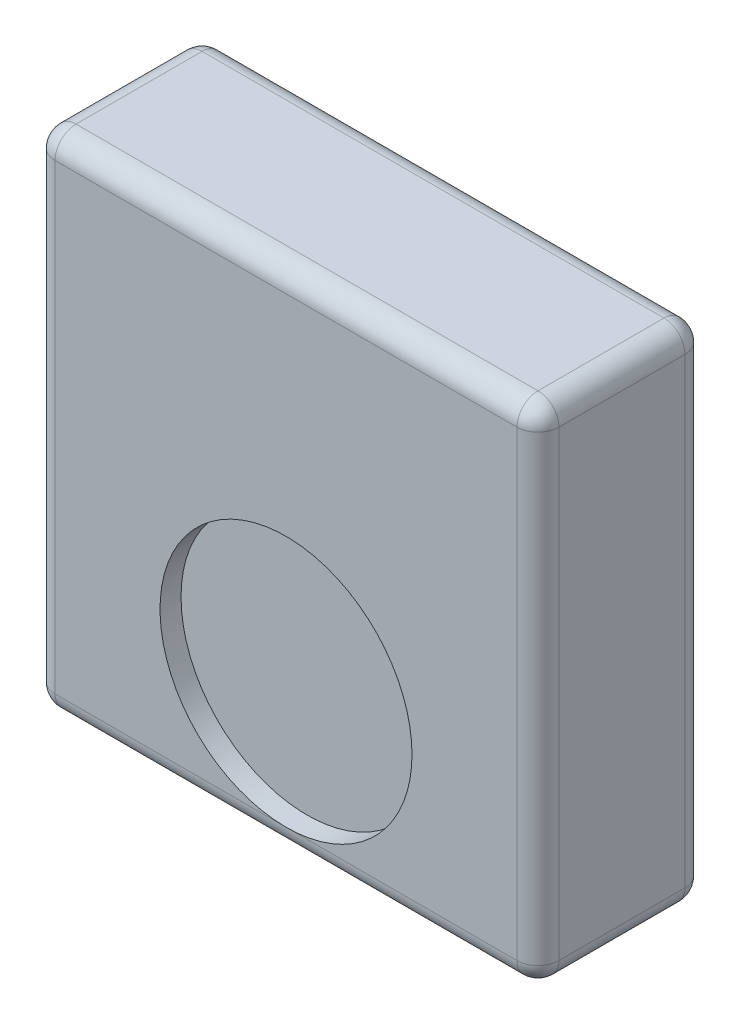
ISO-10303-21;
HEADER;
FILE_DESCRIPTION(('STEP AP214'),'2;1');
FILE_NAME('part.step','',(''),(''),'','','');
FILE_SCHEMA(('AUTOMOTIVE_DESIGN { 1 0 10303 214 1 1 1 1 }'));
ENDSEC;
DATA;
#1=APPLICATION_CONTEXT('core data for automotive mechanical design processes');
#2=APPLICATION_PROTOCOL_DEFINITION('international standard','automotive_design',2000,#1);
#3=PRODUCT_CONTEXT('',#1,'mechanical');
#4=PRODUCT('Part','Part','',(#3));
#5=PRODUCT_RELATED_PRODUCT_CATEGORY('part','',(#4));
#6=PRODUCT_DEFINITION_FORMATION('','',#4);
#7=PRODUCT_DEFINITION_CONTEXT('part definition',#1,'design');
#8=PRODUCT_DEFINITION('design','',#6,#7);
#9=PRODUCT_DEFINITION_SHAPE('','',#8);
#10=(LENGTH_UNIT() NAMED_UNIT(*) SI_UNIT(.MILLI.,.METRE.));
#11=(NAMED_UNIT(*) PLANE_ANGLE_UNIT() SI_UNIT($,.RADIAN.));
#12=(NAMED_UNIT(*) SI_UNIT($,.STERADIAN.) SOLID_ANGLE_UNIT());
#13=UNCERTAINTY_MEASURE_WITH_UNIT(LENGTH_MEASURE(1.E-05),#10,'distance_accuracy_value','');
#14=(GEOMETRIC_REPRESENTATION_CONTEXT(3) GLOBAL_UNCERTAINTY_ASSIGNED_CONTEXT((#13)) GLOBAL_UNIT_ASSIGNED_CONTEXT((#10,
#11,#12)) REPRESENTATION_CONTEXT('',''));
#15=CARTESIAN_POINT('',(0.,0.,0.));
#16=DIRECTION('',(0.,0.,1.));
#17=DIRECTION('',(1.,0.,0.));
#18=AXIS2_PLACEMENT_3D('',#15,#16,#17);
#19=CARTESIAN_POINT('',(76.2,-76.2,25.4));
#20=DIRECTION('',(-1.,0.,0.));
#21=DIRECTION('',(0.,-1.,0.));
#22=AXIS2_PLACEMENT_3D('',#19,#20,#21);
#23=PLANE('',#22);
#24=DIRECTION('',(0.,0.,-1.));
#25=VECTOR('',#24,1.);
#26=CARTESIAN_POINT('',(76.2,69.85,25.4));
#27=LINE('',#26,#25);
#28=CARTESIAN_POINT('',(76.2,69.85,-19.05));
#29=VERTEX_POINT('',#28);
#30=CARTESIAN_POINT('',(76.2,69.85,19.05));
#31=VERTEX_POINT('',#30);
#32=EDGE_CURVE('E157',#29,#31,#27,.F.);
#33=ORIENTED_EDGE('',*,*,#32,.T.);
#34=DIRECTION('',(0.,1.,0.));
#35=VECTOR('',#34,1.);
#36=CARTESIAN_POINT('',(76.2,-76.2,19.05));
#37=LINE('',#36,#35);
#38=CARTESIAN_POINT('',(76.2,-69.85,19.05));
#39=VERTEX_POINT('',#38);
#40=EDGE_CURVE('E159',#31,#39,#37,.F.);
#41=ORIENTED_EDGE('',*,*,#40,.T.);
#42=DIRECTION('',(0.,0.,-1.));
#43=VECTOR('',#42,1.);
#44=CARTESIAN_POINT('',(76.2,-69.85,25.4));
#45=LINE('',#44,#43);
#46=CARTESIAN_POINT('',(76.2,-69.85,-19.05));
#47=VERTEX_POINT('',#46);
#48=EDGE_CURVE('E153',#39,#47,#45,.T.);
#49=ORIENTED_EDGE('',*,*,#48,.T.);
#50=DIRECTION('',(0.,1.,0.));
#51=VECTOR('',#50,1.);
#52=CARTESIAN_POINT('',(76.2,76.2,-19.05));
#53=LINE('',#52,#51);
#54=EDGE_CURVE('E155',#47,#29,#53,.T.);
#55=ORIENTED_EDGE('',*,*,#54,.T.);
#56=EDGE_LOOP('',(#33,#41,#49,#55));
#57=FACE_BOUND('',#56,.T.);
#58=ADVANCED_FACE('F35',(#57),#23,.F.);
#59=CARTESIAN_POINT('',(-76.2,76.2,25.4));
#60=DIRECTION('',(0.,-1.,0.));
#61=DIRECTION('',(0.,0.,-1.));
#62=AXIS2_PLACEMENT_3D('',#59,#60,#61);
#63=PLANE('',#62);
#64=DIRECTION('',(-1.,0.,0.));
#65=VECTOR('',#64,1.);
#66=CARTESIAN_POINT('',(-76.2,76.2,19.05));
#67=LINE('',#66,#65);
#68=CARTESIAN_POINT('',(-69.85,76.2,19.05));
#69=VERTEX_POINT('',#68);
#70=CARTESIAN_POINT('',(69.85,76.2,19.05));
#71=VERTEX_POINT('',#70);
#72=EDGE_CURVE('E166',#69,#71,#67,.F.);
#73=ORIENTED_EDGE('',*,*,#72,.T.);
#74=DIRECTION('',(0.,0.,-1.));
#75=VECTOR('',#74,1.);
#76=CARTESIAN_POINT('',(69.85,76.2,25.4));
#77=LINE('',#76,#75);
#78=CARTESIAN_POINT('',(69.85,76.2,-19.05));
#79=VERTEX_POINT('',#78);
#80=EDGE_CURVE('E168',#71,#79,#77,.T.);
#81=ORIENTED_EDGE('',*,*,#80,.T.);
#82=DIRECTION('',(-1.,0.,0.));
#83=VECTOR('',#82,1.);
#84=CARTESIAN_POINT('',(-76.2,76.2,-19.05));
#85=LINE('',#84,#83);
#86=CARTESIAN_POINT('',(-69.85,76.2,-19.05));
#87=VERTEX_POINT('',#86);
#88=EDGE_CURVE('E164',#79,#87,#85,.T.);
#89=ORIENTED_EDGE('',*,*,#88,.T.);
#90=DIRECTION('',(0.,0.,-1.));
#91=VECTOR('',#90,1.);
#92=CARTESIAN_POINT('',(-69.85,76.2,25.4));
#93=LINE('',#92,#91);
#94=EDGE_CURVE('E162',#87,#69,#93,.F.);
#95=ORIENTED_EDGE('',*,*,#94,.T.);
#96=EDGE_LOOP('',(#73,#81,#89,#95));
#97=FACE_BOUND('',#96,.T.);
#98=ADVANCED_FACE('F283',(#97),#63,.F.);
#99=CARTESIAN_POINT('',(-76.2,-76.2,25.4));
#100=DIRECTION('',(1.,0.,0.));
#101=DIRECTION('',(0.,0.,-1.));
#102=AXIS2_PLACEMENT_3D('',#99,#100,#101);
#103=PLANE('',#102);
#104=DIRECTION('',(0.,-1.,0.));
#105=VECTOR('',#104,1.);
#106=CARTESIAN_POINT('',(-76.2,-76.2,19.05));
#107=LINE('',#106,#105);
#108=CARTESIAN_POINT('',(-76.2,-69.85,19.05));
#109=VERTEX_POINT('',#108);
#110=CARTESIAN_POINT('',(-76.2,69.85,19.05));
#111=VERTEX_POINT('',#110);
#112=EDGE_CURVE('E44',#109,#111,#107,.F.);
#113=ORIENTED_EDGE('',*,*,#112,.T.);
#114=DIRECTION('',(0.,0.,-1.));
#115=VECTOR('',#114,1.);
#116=CARTESIAN_POINT('',(-76.2,69.85,25.4));
#117=LINE('',#116,#115);
#118=CARTESIAN_POINT('',(-76.2,69.85,-19.05));
#119=VERTEX_POINT('',#118);
#120=EDGE_CURVE('E11',#111,#119,#117,.T.);
#121=ORIENTED_EDGE('',*,*,#120,.T.);
#122=DIRECTION('',(0.,-1.,0.));
#123=VECTOR('',#122,1.);
#124=CARTESIAN_POINT('',(-76.2,-76.2,-19.05));
#125=LINE('',#124,#123);
#126=CARTESIAN_POINT('',(-76.2,-69.85,-19.05));
#127=VERTEX_POINT('',#126);
#128=EDGE_CURVE('E189',#119,#127,#125,.T.);
#129=ORIENTED_EDGE('',*,*,#128,.T.);
#130=DIRECTION('',(0.,0.,-1.));
#131=VECTOR('',#130,1.);
#132=CARTESIAN_POINT('',(-76.2,-69.85,25.4));
#133=LINE('',#132,#131);
#134=EDGE_CURVE('E55',#127,#109,#133,.F.);
#135=ORIENTED_EDGE('',*,*,#134,.T.);
#136=EDGE_LOOP('',(#113,#121,#129,#135));
#137=FACE_BOUND('',#136,.T.);
#138=ADVANCED_FACE('F265',(#137),#103,.F.);
#139=CARTESIAN_POINT('',(-76.2,-76.2,25.4));
#140=DIRECTION('',(0.,1.,0.));
#141=DIRECTION('',(-1.,0.,0.));
#142=AXIS2_PLACEMENT_3D('',#139,#140,#141);
#143=PLANE('',#142);
#144=DIRECTION('',(0.,0.,-1.));
#145=VECTOR('',#144,1.);
#146=CARTESIAN_POINT('',(69.85,-76.2,25.4));
#147=LINE('',#146,#145);
#148=CARTESIAN_POINT('',(69.85,-76.2,-19.05));
#149=VERTEX_POINT('',#148);
#150=CARTESIAN_POINT('',(69.85,-76.2,19.05));
#151=VERTEX_POINT('',#150);
#152=EDGE_CURVE('E184',#149,#151,#147,.F.);
#153=ORIENTED_EDGE('',*,*,#152,.T.);
#154=DIRECTION('',(1.,0.,0.));
#155=VECTOR('',#154,1.);
#156=CARTESIAN_POINT('',(-76.2,-76.2,19.05));
#157=LINE('',#156,#155);
#158=CARTESIAN_POINT('',(-69.85,-76.2,19.05));
#159=VERTEX_POINT('',#158);
#160=EDGE_CURVE('E186',#151,#159,#157,.F.);
#161=ORIENTED_EDGE('',*,*,#160,.T.);
#162=DIRECTION('',(0.,0.,-1.));
#163=VECTOR('',#162,1.);
#164=CARTESIAN_POINT('',(-69.85,-76.2,25.4));
#165=LINE('',#164,#163);
#166=CARTESIAN_POINT('',(-69.85,-76.2,-19.05));
#167=VERTEX_POINT('',#166);
#168=EDGE_CURVE('E180',#159,#167,#165,.T.);
#169=ORIENTED_EDGE('',*,*,#168,.T.);
#170=DIRECTION('',(1.,0.,0.));
#171=VECTOR('',#170,1.);
#172=CARTESIAN_POINT('',(76.2,-76.2,-19.05));
#173=LINE('',#172,#171);
#174=EDGE_CURVE('E182',#167,#149,#173,.T.);
#175=ORIENTED_EDGE('',*,*,#174,.T.);
#176=EDGE_LOOP('',(#153,#161,#169,#175));
#177=FACE_BOUND('',#176,.T.);
#178=ADVANCED_FACE('F311',(#177),#143,.F.);
#179=CARTESIAN_POINT('',(0.,0.,25.4));
#180=DIRECTION('',(0.,0.,-1.));
#181=DIRECTION('',(-1.,0.,0.));
#182=AXIS2_PLACEMENT_3D('',#179,#180,#181);
#183=PLANE('',#182);
#184=CARTESIAN_POINT('',(0.,-31.75,25.4));
#185=DIRECTION('',(0.,0.,1.));
#186=DIRECTION('',(1.,0.,0.));
#187=AXIS2_PLACEMENT_3D('',#184,#185,#186);
#188=CIRCLE('',#187,38.1);
#189=CARTESIAN_POINT('',(0.,-69.85,25.4));
#190=VERTEX_POINT('',#189);
#191=EDGE_CURVE('E129',#190,#190,#188,.T.);
#192=ORIENTED_EDGE('',*,*,#191,.F.);
#193=DIRECTION('',(1.,0.,0.));
#194=VECTOR('',#193,1.);
#195=CARTESIAN_POINT('',(0.,-69.85,25.4));
#196=LINE('',#195,#194);
#197=CARTESIAN_POINT('',(69.85,-69.85,25.4));
#198=VERTEX_POINT('',#197);
#199=EDGE_CURVE('E151',#190,#198,#196,.T.);
#200=ORIENTED_EDGE('',*,*,#199,.T.);
#201=DIRECTION('',(0.,1.,0.));
#202=VECTOR('',#201,1.);
#203=CARTESIAN_POINT('',(69.85,0.,25.4));
#204=LINE('',#203,#202);
#205=CARTESIAN_POINT('',(69.85,69.85,25.4));
#206=VERTEX_POINT('',#205);
#207=EDGE_CURVE('E148',#198,#206,#204,.T.);
#208=ORIENTED_EDGE('',*,*,#207,.T.);
#209=DIRECTION('',(-1.,0.,0.));
#210=VECTOR('',#209,1.);
#211=CARTESIAN_POINT('',(0.,69.85,25.4));
#212=LINE('',#211,#210);
#213=CARTESIAN_POINT('',(-69.85,69.85,25.4));
#214=VERTEX_POINT('',#213);
#215=EDGE_CURVE('E135',#206,#214,#212,.T.);
#216=ORIENTED_EDGE('',*,*,#215,.T.);
#217=DIRECTION('',(0.,-1.,0.));
#218=VECTOR('',#217,1.);
#219=CARTESIAN_POINT('',(-69.85,0.,25.4));
#220=LINE('',#219,#218);
#221=CARTESIAN_POINT('',(-69.85,-69.85,25.4));
#222=VERTEX_POINT('',#221);
#223=EDGE_CURVE('E132',#214,#222,#220,.T.);
#224=ORIENTED_EDGE('',*,*,#223,.T.);
#225=DIRECTION('',(1.,0.,0.));
#226=VECTOR('',#225,1.);
#227=CARTESIAN_POINT('',(0.,-69.85,25.4));
#228=LINE('',#227,#226);
#229=EDGE_CURVE('E126',#222,#190,#228,.T.);
#230=ORIENTED_EDGE('',*,*,#229,.T.);
#231=EDGE_LOOP('',(#192,#200,#208,#216,#224,#230));
#232=FACE_BOUND('',#231,.T.);
#233=ADVANCED_FACE('F128',(#232),#183,.F.);
#234=CARTESIAN_POINT('',(0.,0.,-25.4));
#235=DIRECTION('',(0.,0.,-1.));
#236=DIRECTION('',(-1.,0.,0.));
#237=AXIS2_PLACEMENT_3D('',#234,#235,#236);
#238=PLANE('',#237);
#239=DIRECTION('',(0.,-1.,0.));
#240=VECTOR('',#239,1.);
#241=CARTESIAN_POINT('',(-69.85,76.2,-25.4));
#242=LINE('',#241,#240);
#243=CARTESIAN_POINT('',(-69.85,-69.85,-25.4));
#244=VERTEX_POINT('',#243);
#245=CARTESIAN_POINT('',(-69.85,69.85,-25.4));
#246=VERTEX_POINT('',#245);
#247=EDGE_CURVE('E171',#244,#246,#242,.F.);
#248=ORIENTED_EDGE('',*,*,#247,.T.);
#249=DIRECTION('',(-1.,0.,0.));
#250=VECTOR('',#249,1.);
#251=CARTESIAN_POINT('',(76.2,69.85,-25.4));
#252=LINE('',#251,#250);
#253=CARTESIAN_POINT('',(69.85,69.85,-25.4));
#254=VERTEX_POINT('',#253);
#255=EDGE_CURVE('E177',#246,#254,#252,.F.);
#256=ORIENTED_EDGE('',*,*,#255,.T.);
#257=DIRECTION('',(0.,1.,0.));
#258=VECTOR('',#257,1.);
#259=CARTESIAN_POINT('',(69.85,-76.2,-25.4));
#260=LINE('',#259,#258);
#261=CARTESIAN_POINT('',(69.85,-69.85,-25.4));
#262=VERTEX_POINT('',#261);
#263=EDGE_CURVE('E175',#254,#262,#260,.F.);
#264=ORIENTED_EDGE('',*,*,#263,.T.);
#265=DIRECTION('',(1.,0.,0.));
#266=VECTOR('',#265,1.);
#267=CARTESIAN_POINT('',(-76.2,-69.85,-25.4));
#268=LINE('',#267,#266);
#269=EDGE_CURVE('E173',#262,#244,#268,.F.);
#270=ORIENTED_EDGE('',*,*,#269,.T.);
#271=EDGE_LOOP('',(#248,#256,#264,#270));
#272=FACE_BOUND('',#271,.T.);
#273=ADVANCED_FACE('F299',(#272),#238,.T.);
#274=CARTESIAN_POINT('',(0.,-31.75,19.05));
#275=DIRECTION('',(0.,0.,1.));
#276=DIRECTION('',(1.,0.,0.));
#277=AXIS2_PLACEMENT_3D('',#274,#275,#276);
#278=CYLINDRICAL_SURFACE('',#277,38.1);
#279=CARTESIAN_POINT('',(0.,-31.75,19.05));
#280=DIRECTION('',(0.,0.,1.));
#281=DIRECTION('',(1.,0.,0.));
#282=AXIS2_PLACEMENT_3D('',#279,#280,#281);
#283=CIRCLE('',#282,38.1);
#284=CARTESIAN_POINT('',(38.1,-31.75,19.05));
#285=VERTEX_POINT('',#284);
#286=EDGE_CURVE('E139',#285,#285,#283,.T.);
#287=ORIENTED_EDGE('',*,*,#286,.F.);
#288=EDGE_LOOP('',(#287));
#289=FACE_BOUND('',#288,.T.);
#290=ORIENTED_EDGE('',*,*,#191,.T.);
#291=EDGE_LOOP('',(#290));
#292=FACE_BOUND('',#291,.T.);
#293=ADVANCED_FACE('F138',(#289,#292),#278,.F.);
#294=CARTESIAN_POINT('',(0.,-31.75,19.05));
#295=DIRECTION('',(0.,0.,1.));
#296=DIRECTION('',(1.,0.,0.));
#297=AXIS2_PLACEMENT_3D('',#294,#295,#296);
#298=PLANE('',#297);
#299=ORIENTED_EDGE('',*,*,#286,.T.);
#300=EDGE_LOOP('',(#299));
#301=FACE_BOUND('',#300,.T.);
#302=ADVANCED_FACE('F362',(#301),#298,.T.);
#303=CARTESIAN_POINT('',(-69.85,-76.2,-19.05));
#304=DIRECTION('',(0.,1.,0.));
#305=DIRECTION('',(0.,0.,1.));
#306=AXIS2_PLACEMENT_3D('',#303,#304,#305);
#307=CYLINDRICAL_SURFACE('',#306,6.35);
#308=CARTESIAN_POINT('',(-69.85,-69.85,-19.05));
#309=DIRECTION('',(0.,-1.,0.));
#310=DIRECTION('',(0.,0.,-1.));
#311=AXIS2_PLACEMENT_3D('',#308,#309,#310);
#312=CIRCLE('',#311,6.35);
#313=EDGE_CURVE('E39',#127,#244,#312,.T.);
#314=ORIENTED_EDGE('',*,*,#313,.F.);
#315=ORIENTED_EDGE('',*,*,#128,.F.);
#316=CARTESIAN_POINT('',(-69.85,69.85,-19.05));
#317=DIRECTION('',(0.,1.,0.));
#318=DIRECTION('',(0.,0.,1.));
#319=AXIS2_PLACEMENT_3D('',#316,#317,#318);
#320=CIRCLE('',#319,6.35);
#321=EDGE_CURVE('E144',#246,#119,#320,.T.);
#322=ORIENTED_EDGE('',*,*,#321,.F.);
#323=ORIENTED_EDGE('',*,*,#247,.F.);
#324=EDGE_LOOP('',(#314,#315,#322,#323));
#325=FACE_BOUND('',#324,.T.);
#326=ADVANCED_FACE('F37',(#325),#307,.T.);
#327=CARTESIAN_POINT('',(-69.85,-69.85,-19.05));
#328=DIRECTION('',(0.,0.,1.));
#329=DIRECTION('',(1.,0.,0.));
#330=AXIS2_PLACEMENT_3D('',#327,#328,#329);
#331=SPHERICAL_SURFACE('',#330,6.35);
#332=CARTESIAN_POINT('',(-69.85,-69.85,-19.05));
#333=DIRECTION('',(0.,0.,-1.));
#334=DIRECTION('',(-1.,0.,0.));
#335=AXIS2_PLACEMENT_3D('',#332,#333,#334);
#336=CIRCLE('',#335,6.35);
#337=EDGE_CURVE('E247',#127,#167,#336,.F.);
#338=ORIENTED_EDGE('',*,*,#337,.F.);
#339=ORIENTED_EDGE('',*,*,#313,.T.);
#340=CARTESIAN_POINT('',(-69.85,-69.85,-19.05));
#341=DIRECTION('',(-1.,0.,0.));
#342=DIRECTION('',(0.,0.,1.));
#343=AXIS2_PLACEMENT_3D('',#340,#341,#342);
#344=CIRCLE('',#343,6.35);
#345=EDGE_CURVE('E250',#167,#244,#344,.F.);
#346=ORIENTED_EDGE('',*,*,#345,.F.);
#347=EDGE_LOOP('',(#338,#339,#346));
#348=FACE_BOUND('',#347,.T.);
#349=ADVANCED_FACE('F303',(#348),#331,.T.);
#350=CARTESIAN_POINT('',(-69.85,69.85,-19.05));
#351=DIRECTION('',(0.,0.,1.));
#352=DIRECTION('',(1.,0.,0.));
#353=AXIS2_PLACEMENT_3D('',#350,#351,#352);
#354=SPHERICAL_SURFACE('',#353,6.35);
#355=CARTESIAN_POINT('',(-69.85,69.85,-19.05));
#356=DIRECTION('',(-1.,0.,0.));
#357=DIRECTION('',(0.,0.,1.));
#358=AXIS2_PLACEMENT_3D('',#355,#356,#357);
#359=CIRCLE('',#358,6.35);
#360=EDGE_CURVE('E242',#246,#87,#359,.F.);
#361=ORIENTED_EDGE('',*,*,#360,.F.);
#362=ORIENTED_EDGE('',*,*,#321,.T.);
#363=CARTESIAN_POINT('',(-69.85,69.85,-19.05));
#364=DIRECTION('',(0.,0.,-1.));
#365=DIRECTION('',(-1.,0.,0.));
#366=AXIS2_PLACEMENT_3D('',#363,#364,#365);
#367=CIRCLE('',#366,6.35);
#368=EDGE_CURVE('E245',#87,#119,#367,.F.);
#369=ORIENTED_EDGE('',*,*,#368,.F.);
#370=EDGE_LOOP('',(#361,#362,#369));
#371=FACE_BOUND('',#370,.T.);
#372=ADVANCED_FACE('F258',(#371),#354,.T.);
#373=CARTESIAN_POINT('',(-76.2,-69.85,-19.05));
#374=DIRECTION('',(-1.,0.,0.));
#375=DIRECTION('',(0.,-1.,0.));
#376=AXIS2_PLACEMENT_3D('',#373,#374,#375);
#377=CYLINDRICAL_SURFACE('',#376,6.35);
#378=ORIENTED_EDGE('',*,*,#345,.T.);
#379=ORIENTED_EDGE('',*,*,#269,.F.);
#380=CARTESIAN_POINT('',(69.85,-69.85,-19.05));
#381=DIRECTION('',(1.,0.,0.));
#382=DIRECTION('',(0.,0.,-1.));
#383=AXIS2_PLACEMENT_3D('',#380,#381,#382);
#384=CIRCLE('',#383,6.35);
#385=EDGE_CURVE('E236',#149,#262,#384,.T.);
#386=ORIENTED_EDGE('',*,*,#385,.F.);
#387=ORIENTED_EDGE('',*,*,#174,.F.);
#388=EDGE_LOOP('',(#378,#379,#386,#387));
#389=FACE_BOUND('',#388,.T.);
#390=ADVANCED_FACE('F306',(#389),#377,.T.);
#391=CARTESIAN_POINT('',(-69.85,-69.85,25.4));
#392=DIRECTION('',(0.,0.,-1.));
#393=DIRECTION('',(-1.,0.,0.));
#394=AXIS2_PLACEMENT_3D('',#391,#392,#393);
#395=CYLINDRICAL_SURFACE('',#394,6.35);
#396=ORIENTED_EDGE('',*,*,#337,.T.);
#397=ORIENTED_EDGE('',*,*,#168,.F.);
#398=CARTESIAN_POINT('',(-69.85,-69.85,19.05));
#399=DIRECTION('',(0.,0.,1.));
#400=DIRECTION('',(1.,0.,0.));
#401=AXIS2_PLACEMENT_3D('',#398,#399,#400);
#402=CIRCLE('',#401,6.35);
#403=EDGE_CURVE('E233',#109,#159,#402,.T.);
#404=ORIENTED_EDGE('',*,*,#403,.F.);
#405=ORIENTED_EDGE('',*,*,#134,.F.);
#406=EDGE_LOOP('',(#396,#397,#404,#405));
#407=FACE_BOUND('',#406,.T.);
#408=ADVANCED_FACE('F316',(#407),#395,.T.);
#409=CARTESIAN_POINT('',(-69.85,0.,19.05));
#410=DIRECTION('',(0.,-1.,0.));
#411=DIRECTION('',(0.,0.,-1.));
#412=AXIS2_PLACEMENT_3D('',#409,#410,#411);
#413=CYLINDRICAL_SURFACE('',#412,6.35);
#414=CARTESIAN_POINT('',(-69.85,69.85,19.05));
#415=DIRECTION('',(0.,1.,0.));
#416=DIRECTION('',(0.,0.,1.));
#417=AXIS2_PLACEMENT_3D('',#414,#415,#416);
#418=CIRCLE('',#417,6.35);
#419=EDGE_CURVE('E227',#111,#214,#418,.T.);
#420=ORIENTED_EDGE('',*,*,#419,.F.);
#421=ORIENTED_EDGE('',*,*,#112,.F.);
#422=CARTESIAN_POINT('',(-69.85,-69.85,19.05));
#423=DIRECTION('',(0.,-1.,0.));
#424=DIRECTION('',(0.,0.,-1.));
#425=AXIS2_PLACEMENT_3D('',#422,#423,#424);
#426=CIRCLE('',#425,6.35);
#427=EDGE_CURVE('E230',#222,#109,#426,.T.);
#428=ORIENTED_EDGE('',*,*,#427,.F.);
#429=ORIENTED_EDGE('',*,*,#223,.F.);
#430=EDGE_LOOP('',(#420,#421,#428,#429));
#431=FACE_BOUND('',#430,.T.);
#432=ADVANCED_FACE('F272',(#431),#413,.T.);
#433=CARTESIAN_POINT('',(-69.85,69.85,25.4));
#434=DIRECTION('',(0.,0.,-1.));
#435=DIRECTION('',(-1.,0.,0.));
#436=AXIS2_PLACEMENT_3D('',#433,#434,#435);
#437=CYLINDRICAL_SURFACE('',#436,6.35);
#438=ORIENTED_EDGE('',*,*,#368,.T.);
#439=ORIENTED_EDGE('',*,*,#120,.F.);
#440=CARTESIAN_POINT('',(-69.85,69.85,19.05));
#441=DIRECTION('',(0.,0.,1.));
#442=DIRECTION('',(1.,0.,0.));
#443=AXIS2_PLACEMENT_3D('',#440,#441,#442);
#444=CIRCLE('',#443,6.35);
#445=EDGE_CURVE('E224',#69,#111,#444,.T.);
#446=ORIENTED_EDGE('',*,*,#445,.F.);
#447=ORIENTED_EDGE('',*,*,#94,.F.);
#448=EDGE_LOOP('',(#438,#439,#446,#447));
#449=FACE_BOUND('',#448,.T.);
#450=ADVANCED_FACE('F269',(#449),#437,.T.);
#451=CARTESIAN_POINT('',(-76.2,69.85,-19.05));
#452=DIRECTION('',(1.,0.,0.));
#453=DIRECTION('',(0.,0.,-1.));
#454=AXIS2_PLACEMENT_3D('',#451,#452,#453);
#455=CYLINDRICAL_SURFACE('',#454,6.35);
#456=ORIENTED_EDGE('',*,*,#360,.T.);
#457=ORIENTED_EDGE('',*,*,#88,.F.);
#458=CARTESIAN_POINT('',(69.85,69.85,-19.05));
#459=DIRECTION('',(1.,0.,0.));
#460=DIRECTION('',(0.,0.,-1.));
#461=AXIS2_PLACEMENT_3D('',#458,#459,#460);
#462=CIRCLE('',#461,6.35);
#463=EDGE_CURVE('E221',#254,#79,#462,.T.);
#464=ORIENTED_EDGE('',*,*,#463,.F.);
#465=ORIENTED_EDGE('',*,*,#255,.F.);
#466=EDGE_LOOP('',(#456,#457,#464,#465));
#467=FACE_BOUND('',#466,.T.);
#468=ADVANCED_FACE('F297',(#467),#455,.T.);
#469=CARTESIAN_POINT('',(69.85,-76.2,-19.05));
#470=DIRECTION('',(0.,-1.,0.));
#471=DIRECTION('',(1.,0.,0.));
#472=AXIS2_PLACEMENT_3D('',#469,#470,#471);
#473=CYLINDRICAL_SURFACE('',#472,6.35);
#474=CARTESIAN_POINT('',(69.85,-69.85,-19.05));
#475=DIRECTION('',(0.,-1.,0.));
#476=DIRECTION('',(0.,0.,-1.));
#477=AXIS2_PLACEMENT_3D('',#474,#475,#476);
#478=CIRCLE('',#477,6.35);
#479=EDGE_CURVE('E239',#262,#47,#478,.T.);
#480=ORIENTED_EDGE('',*,*,#479,.F.);
#481=ORIENTED_EDGE('',*,*,#263,.F.);
#482=CARTESIAN_POINT('',(69.85,69.85,-19.05));
#483=DIRECTION('',(0.,1.,0.));
#484=DIRECTION('',(0.,0.,1.));
#485=AXIS2_PLACEMENT_3D('',#482,#483,#484);
#486=CIRCLE('',#485,6.35);
#487=EDGE_CURVE('E219',#29,#254,#486,.T.);
#488=ORIENTED_EDGE('',*,*,#487,.F.);
#489=ORIENTED_EDGE('',*,*,#54,.F.);
#490=EDGE_LOOP('',(#480,#481,#488,#489));
#491=FACE_BOUND('',#490,.T.);
#492=ADVANCED_FACE('F388',(#491),#473,.T.);
#493=CARTESIAN_POINT('',(69.85,-69.85,-19.05));
#494=DIRECTION('',(0.,0.,1.));
#495=DIRECTION('',(1.,0.,0.));
#496=AXIS2_PLACEMENT_3D('',#493,#494,#495);
#497=SPHERICAL_SURFACE('',#496,6.35);
#498=ORIENTED_EDGE('',*,*,#385,.T.);
#499=ORIENTED_EDGE('',*,*,#479,.T.);
#500=CARTESIAN_POINT('',(69.85,-69.85,-19.05));
#501=DIRECTION('',(0.,0.,-1.));
#502=DIRECTION('',(-1.,0.,0.));
#503=AXIS2_PLACEMENT_3D('',#500,#501,#502);
#504=CIRCLE('',#503,6.35);
#505=EDGE_CURVE('E216',#149,#47,#504,.F.);
#506=ORIENTED_EDGE('',*,*,#505,.F.);
#507=EDGE_LOOP('',(#498,#499,#506));
#508=FACE_BOUND('',#507,.T.);
#509=ADVANCED_FACE('F391',(#508),#497,.T.);
#510=CARTESIAN_POINT('',(-69.85,-69.85,19.05));
#511=DIRECTION('',(0.,0.,1.));
#512=DIRECTION('',(1.,0.,0.));
#513=AXIS2_PLACEMENT_3D('',#510,#511,#512);
#514=SPHERICAL_SURFACE('',#513,6.35);
#515=ORIENTED_EDGE('',*,*,#427,.T.);
#516=ORIENTED_EDGE('',*,*,#403,.T.);
#517=CARTESIAN_POINT('',(-69.85,-69.85,19.05));
#518=DIRECTION('',(-1.,0.,0.));
#519=DIRECTION('',(0.,0.,1.));
#520=AXIS2_PLACEMENT_3D('',#517,#518,#519);
#521=CIRCLE('',#520,6.35);
#522=EDGE_CURVE('E214',#222,#159,#521,.F.);
#523=ORIENTED_EDGE('',*,*,#522,.F.);
#524=EDGE_LOOP('',(#515,#516,#523));
#525=FACE_BOUND('',#524,.T.);
#526=ADVANCED_FACE('F319',(#525),#514,.T.);
#527=CARTESIAN_POINT('',(-69.85,69.85,19.05));
#528=DIRECTION('',(0.,0.,1.));
#529=DIRECTION('',(1.,0.,0.));
#530=AXIS2_PLACEMENT_3D('',#527,#528,#529);
#531=SPHERICAL_SURFACE('',#530,6.35);
#532=ORIENTED_EDGE('',*,*,#445,.T.);
#533=ORIENTED_EDGE('',*,*,#419,.T.);
#534=CARTESIAN_POINT('',(-69.85,69.85,19.05));
#535=DIRECTION('',(-1.,0.,0.));
#536=DIRECTION('',(0.,0.,1.));
#537=AXIS2_PLACEMENT_3D('',#534,#535,#536);
#538=CIRCLE('',#537,6.35);
#539=EDGE_CURVE('E211',#69,#214,#538,.F.);
#540=ORIENTED_EDGE('',*,*,#539,.F.);
#541=EDGE_LOOP('',(#532,#533,#540));
#542=FACE_BOUND('',#541,.T.);
#543=ADVANCED_FACE('F275',(#542),#531,.T.);
#544=CARTESIAN_POINT('',(69.85,69.85,-19.05));
#545=DIRECTION('',(0.,0.,1.));
#546=DIRECTION('',(1.,0.,0.));
#547=AXIS2_PLACEMENT_3D('',#544,#545,#546);
#548=SPHERICAL_SURFACE('',#547,6.35);
#549=ORIENTED_EDGE('',*,*,#487,.T.);
#550=ORIENTED_EDGE('',*,*,#463,.T.);
#551=CARTESIAN_POINT('',(69.85,69.85,-19.05));
#552=DIRECTION('',(0.,0.,-1.));
#553=DIRECTION('',(-1.,0.,0.));
#554=AXIS2_PLACEMENT_3D('',#551,#552,#553);
#555=CIRCLE('',#554,6.35);
#556=EDGE_CURVE('E209',#29,#79,#555,.F.);
#557=ORIENTED_EDGE('',*,*,#556,.F.);
#558=EDGE_LOOP('',(#549,#550,#557));
#559=FACE_BOUND('',#558,.T.);
#560=ADVANCED_FACE('F293',(#559),#548,.T.);
#561=CARTESIAN_POINT('',(69.85,-69.85,25.4));
#562=DIRECTION('',(0.,0.,-1.));
#563=DIRECTION('',(-1.,0.,0.));
#564=AXIS2_PLACEMENT_3D('',#561,#562,#563);
#565=CYLINDRICAL_SURFACE('',#564,6.35);
#566=ORIENTED_EDGE('',*,*,#505,.T.);
#567=ORIENTED_EDGE('',*,*,#48,.F.);
#568=CARTESIAN_POINT('',(69.85,-69.85,19.05));
#569=DIRECTION('',(0.,0.,1.));
#570=DIRECTION('',(1.,0.,0.));
#571=AXIS2_PLACEMENT_3D('',#568,#569,#570);
#572=CIRCLE('',#571,6.35);
#573=EDGE_CURVE('E206',#151,#39,#572,.T.);
#574=ORIENTED_EDGE('',*,*,#573,.F.);
#575=ORIENTED_EDGE('',*,*,#152,.F.);
#576=EDGE_LOOP('',(#566,#567,#574,#575));
#577=FACE_BOUND('',#576,.T.);
#578=ADVANCED_FACE('F326',(#577),#565,.T.);
#579=CARTESIAN_POINT('',(0.,-69.85,19.05));
#580=DIRECTION('',(1.,0.,0.));
#581=DIRECTION('',(0.,1.,0.));
#582=AXIS2_PLACEMENT_3D('',#579,#580,#581);
#583=CYLINDRICAL_SURFACE('',#582,6.35);
#584=ORIENTED_EDGE('',*,*,#522,.T.);
#585=ORIENTED_EDGE('',*,*,#160,.F.);
#586=CARTESIAN_POINT('',(69.85,-69.85,19.05));
#587=DIRECTION('',(1.,0.,0.));
#588=DIRECTION('',(0.,0.,-1.));
#589=AXIS2_PLACEMENT_3D('',#586,#587,#588);
#590=CIRCLE('',#589,6.35);
#591=EDGE_CURVE('E203',#198,#151,#590,.T.);
#592=ORIENTED_EDGE('',*,*,#591,.F.);
#593=ORIENTED_EDGE('',*,*,#199,.F.);
#594=ORIENTED_EDGE('',*,*,#229,.F.);
#595=EDGE_LOOP('',(#584,#585,#592,#593,#594));
#596=FACE_BOUND('',#595,.T.);
#597=ADVANCED_FACE('F320',(#596),#583,.T.);
#598=CARTESIAN_POINT('',(0.,69.85,19.05));
#599=DIRECTION('',(-1.,0.,0.));
#600=DIRECTION('',(0.,0.,1.));
#601=AXIS2_PLACEMENT_3D('',#598,#599,#600);
#602=CYLINDRICAL_SURFACE('',#601,6.35);
#603=ORIENTED_EDGE('',*,*,#539,.T.);
#604=ORIENTED_EDGE('',*,*,#215,.F.);
#605=CARTESIAN_POINT('',(69.85,69.85,19.05));
#606=DIRECTION('',(1.,0.,0.));
#607=DIRECTION('',(0.,0.,-1.));
#608=AXIS2_PLACEMENT_3D('',#605,#606,#607);
#609=CIRCLE('',#608,6.35);
#610=EDGE_CURVE('E200',#71,#206,#609,.T.);
#611=ORIENTED_EDGE('',*,*,#610,.F.);
#612=ORIENTED_EDGE('',*,*,#72,.F.);
#613=EDGE_LOOP('',(#603,#604,#611,#612));
#614=FACE_BOUND('',#613,.T.);
#615=ADVANCED_FACE('F280',(#614),#602,.T.);
#616=CARTESIAN_POINT('',(69.85,69.85,25.4));
#617=DIRECTION('',(0.,0.,-1.));
#618=DIRECTION('',(-1.,0.,0.));
#619=AXIS2_PLACEMENT_3D('',#616,#617,#618);
#620=CYLINDRICAL_SURFACE('',#619,6.35);
#621=ORIENTED_EDGE('',*,*,#556,.T.);
#622=ORIENTED_EDGE('',*,*,#80,.F.);
#623=CARTESIAN_POINT('',(69.85,69.85,19.05));
#624=DIRECTION('',(0.,0.,1.));
#625=DIRECTION('',(1.,0.,0.));
#626=AXIS2_PLACEMENT_3D('',#623,#624,#625);
#627=CIRCLE('',#626,6.35);
#628=EDGE_CURVE('E197',#31,#71,#627,.T.);
#629=ORIENTED_EDGE('',*,*,#628,.F.);
#630=ORIENTED_EDGE('',*,*,#32,.F.);
#631=EDGE_LOOP('',(#621,#622,#629,#630));
#632=FACE_BOUND('',#631,.T.);
#633=ADVANCED_FACE('F286',(#632),#620,.T.);
#634=CARTESIAN_POINT('',(69.85,-69.85,19.05));
#635=DIRECTION('',(0.,0.,1.));
#636=DIRECTION('',(1.,0.,0.));
#637=AXIS2_PLACEMENT_3D('',#634,#635,#636);
#638=SPHERICAL_SURFACE('',#637,6.35);
#639=ORIENTED_EDGE('',*,*,#591,.T.);
#640=ORIENTED_EDGE('',*,*,#573,.T.);
#641=CARTESIAN_POINT('',(69.85,-69.85,19.05));
#642=DIRECTION('',(0.,-1.,0.));
#643=DIRECTION('',(0.,0.,-1.));
#644=AXIS2_PLACEMENT_3D('',#641,#642,#643);
#645=CIRCLE('',#644,6.35);
#646=EDGE_CURVE('E195',#198,#39,#645,.F.);
#647=ORIENTED_EDGE('',*,*,#646,.F.);
#648=EDGE_LOOP('',(#639,#640,#647));
#649=FACE_BOUND('',#648,.T.);
#650=ADVANCED_FACE('F328',(#649),#638,.T.);
#651=CARTESIAN_POINT('',(69.85,69.85,19.05));
#652=DIRECTION('',(0.,0.,1.));
#653=DIRECTION('',(1.,0.,0.));
#654=AXIS2_PLACEMENT_3D('',#651,#652,#653);
#655=SPHERICAL_SURFACE('',#654,6.35);
#656=ORIENTED_EDGE('',*,*,#628,.T.);
#657=ORIENTED_EDGE('',*,*,#610,.T.);
#658=CARTESIAN_POINT('',(69.85,69.85,19.05));
#659=DIRECTION('',(0.,1.,0.));
#660=DIRECTION('',(0.,0.,1.));
#661=AXIS2_PLACEMENT_3D('',#658,#659,#660);
#662=CIRCLE('',#661,6.35);
#663=EDGE_CURVE('E193',#31,#206,#662,.F.);
#664=ORIENTED_EDGE('',*,*,#663,.F.);
#665=EDGE_LOOP('',(#656,#657,#664));
#666=FACE_BOUND('',#665,.T.);
#667=ADVANCED_FACE('F334',(#666),#655,.T.);
#668=CARTESIAN_POINT('',(69.85,0.,19.05));
#669=DIRECTION('',(0.,1.,0.));
#670=DIRECTION('',(-1.,0.,0.));
#671=AXIS2_PLACEMENT_3D('',#668,#669,#670);
#672=CYLINDRICAL_SURFACE('',#671,6.35);
#673=ORIENTED_EDGE('',*,*,#646,.T.);
#674=ORIENTED_EDGE('',*,*,#40,.F.);
#675=ORIENTED_EDGE('',*,*,#663,.T.);
#676=ORIENTED_EDGE('',*,*,#207,.F.);
#677=EDGE_LOOP('',(#673,#674,#675,#676));
#678=FACE_BOUND('',#677,.T.);
#679=ADVANCED_FACE('F331',(#678),#672,.T.);
#680=CLOSED_SHELL('',(#58,#98,#138,#178,#233,#273,#293,#302,#326,#349,#372,#390,#408,#432,#450,
#468,#492,#509,#526,#543,#560,#578,#597,#615,#633,#650,#667,#679));
#681=MANIFOLD_SOLID_BREP('B2',#680);
#682=ADVANCED_BREP_SHAPE_REPRESENTATION('',(#18,#681),#14);
#683=SHAPE_DEFINITION_REPRESENTATION(#9,#682);
ENDSEC;
END-ISO-10303-21;
